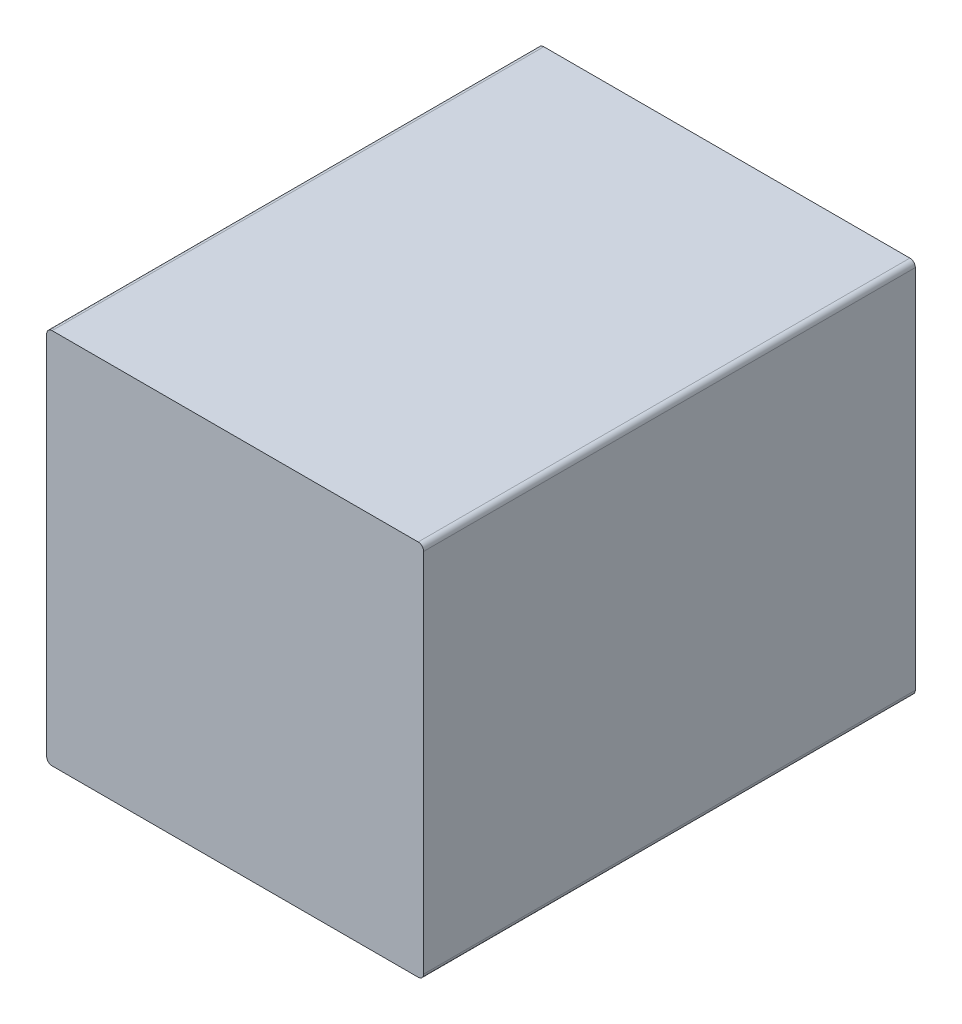
ISO-10303-21;
HEADER;
FILE_DESCRIPTION(('STEP AP214'),'2;1');
FILE_NAME('part.step','',(''),(''),'','','');
FILE_SCHEMA(('AUTOMOTIVE_DESIGN { 1 0 10303 214 1 1 1 1 }'));
ENDSEC;
DATA;
#1=APPLICATION_CONTEXT('core data for automotive mechanical design processes');
#2=APPLICATION_PROTOCOL_DEFINITION('international standard','automotive_design',2000,#1);
#3=PRODUCT_CONTEXT('',#1,'mechanical');
#4=PRODUCT('Part','Part','',(#3));
#5=PRODUCT_RELATED_PRODUCT_CATEGORY('part','',(#4));
#6=PRODUCT_DEFINITION_FORMATION('','',#4);
#7=PRODUCT_DEFINITION_CONTEXT('part definition',#1,'design');
#8=PRODUCT_DEFINITION('design','',#6,#7);
#9=PRODUCT_DEFINITION_SHAPE('','',#8);
#10=(LENGTH_UNIT() NAMED_UNIT(*) SI_UNIT(.MILLI.,.METRE.));
#11=(NAMED_UNIT(*) PLANE_ANGLE_UNIT() SI_UNIT($,.RADIAN.));
#12=(NAMED_UNIT(*) SI_UNIT($,.STERADIAN.) SOLID_ANGLE_UNIT());
#13=UNCERTAINTY_MEASURE_WITH_UNIT(LENGTH_MEASURE(1.E-05),#10,'distance_accuracy_value','');
#14=(GEOMETRIC_REPRESENTATION_CONTEXT(3) GLOBAL_UNCERTAINTY_ASSIGNED_CONTEXT((#13)) GLOBAL_UNIT_ASSIGNED_CONTEXT((#10,
#11,#12)) REPRESENTATION_CONTEXT('',''));
#15=CARTESIAN_POINT('',(0.,0.,0.));
#16=DIRECTION('',(0.,0.,1.));
#17=DIRECTION('',(1.,0.,0.));
#18=AXIS2_PLACEMENT_3D('',#15,#16,#17);
#19=CARTESIAN_POINT('',(-16.75,-16.75,56.8));
#20=DIRECTION('',(0.,0.,-1.));
#21=DIRECTION('',(-1.,0.,0.));
#22=AXIS2_PLACEMENT_3D('',#19,#20,#21);
#23=CYLINDRICAL_SURFACE('',#22,0.500000000000007);
#24=CARTESIAN_POINT('',(-16.75,-16.75,11.8));
#25=DIRECTION('',(0.,0.,1.));
#26=DIRECTION('',(1.,0.,0.));
#27=AXIS2_PLACEMENT_3D('',#24,#25,#26);
#28=CIRCLE('',#27,0.500000000000007);
#29=CARTESIAN_POINT('',(-17.25,-16.75,11.8));
#30=VERTEX_POINT('',#29);
#31=CARTESIAN_POINT('',(-16.75,-17.25,11.8));
#32=VERTEX_POINT('',#31);
#33=EDGE_CURVE('E131',#30,#32,#28,.T.);
#34=ORIENTED_EDGE('',*,*,#33,.T.);
#35=DIRECTION('',(0.,0.,-1.));
#36=VECTOR('',#35,1.);
#37=CARTESIAN_POINT('',(-16.75,-17.25,56.8));
#38=LINE('',#37,#36);
#39=CARTESIAN_POINT('',(-16.75,-17.25,56.8));
#40=VERTEX_POINT('',#39);
#41=EDGE_CURVE('E11',#40,#32,#38,.T.);
#42=ORIENTED_EDGE('',*,*,#41,.F.);
#43=CARTESIAN_POINT('',(-16.75,-16.75,56.8));
#44=DIRECTION('',(0.,0.,1.));
#45=DIRECTION('',(1.,0.,0.));
#46=AXIS2_PLACEMENT_3D('',#43,#44,#45);
#47=CIRCLE('',#46,0.500000000000007);
#48=CARTESIAN_POINT('',(-17.25,-16.75,56.8));
#49=VERTEX_POINT('',#48);
#50=EDGE_CURVE('E145',#49,#40,#47,.T.);
#51=ORIENTED_EDGE('',*,*,#50,.F.);
#52=DIRECTION('',(0.,0.,-1.));
#53=VECTOR('',#52,1.);
#54=CARTESIAN_POINT('',(-17.25,-16.75,56.8));
#55=LINE('',#54,#53);
#56=EDGE_CURVE('E127',#49,#30,#55,.T.);
#57=ORIENTED_EDGE('',*,*,#56,.T.);
#58=EDGE_LOOP('',(#34,#42,#51,#57));
#59=FACE_BOUND('',#58,.T.);
#60=ADVANCED_FACE('F35',(#59),#23,.T.);
#61=CARTESIAN_POINT('',(-16.75,-17.25,56.8));
#62=DIRECTION('',(0.,1.,0.));
#63=DIRECTION('',(0.,0.,1.));
#64=AXIS2_PLACEMENT_3D('',#61,#62,#63);
#65=PLANE('',#64);
#66=DIRECTION('',(1.,0.,0.));
#67=VECTOR('',#66,1.);
#68=CARTESIAN_POINT('',(-16.75,-17.25,11.8));
#69=LINE('',#68,#67);
#70=CARTESIAN_POINT('',(16.75,-17.25,11.8));
#71=VERTEX_POINT('',#70);
#72=EDGE_CURVE('E134',#32,#71,#69,.T.);
#73=ORIENTED_EDGE('',*,*,#72,.T.);
#74=DIRECTION('',(0.,0.,-1.));
#75=VECTOR('',#74,1.);
#76=CARTESIAN_POINT('',(16.75,-17.25,56.8));
#77=LINE('',#76,#75);
#78=CARTESIAN_POINT('',(16.75,-17.25,56.8));
#79=VERTEX_POINT('',#78);
#80=EDGE_CURVE('E43',#79,#71,#77,.T.);
#81=ORIENTED_EDGE('',*,*,#80,.F.);
#82=DIRECTION('',(1.,0.,0.));
#83=VECTOR('',#82,1.);
#84=CARTESIAN_POINT('',(-16.75,-17.25,56.8));
#85=LINE('',#84,#83);
#86=EDGE_CURVE('E94',#40,#79,#85,.T.);
#87=ORIENTED_EDGE('',*,*,#86,.F.);
#88=ORIENTED_EDGE('',*,*,#41,.T.);
#89=EDGE_LOOP('',(#73,#81,#87,#88));
#90=FACE_BOUND('',#89,.T.);
#91=ADVANCED_FACE('F180',(#90),#65,.F.);
#92=CARTESIAN_POINT('',(16.75,-16.75,56.8));
#93=DIRECTION('',(0.,0.,-1.));
#94=DIRECTION('',(-1.,0.,0.));
#95=AXIS2_PLACEMENT_3D('',#92,#93,#94);
#96=CYLINDRICAL_SURFACE('',#95,0.500000000000007);
#97=CARTESIAN_POINT('',(16.75,-16.75,11.8));
#98=DIRECTION('',(0.,0.,1.));
#99=DIRECTION('',(1.,0.,0.));
#100=AXIS2_PLACEMENT_3D('',#97,#98,#99);
#101=CIRCLE('',#100,0.500000000000007);
#102=CARTESIAN_POINT('',(17.25,-16.75,11.8));
#103=VERTEX_POINT('',#102);
#104=EDGE_CURVE('E136',#71,#103,#101,.T.);
#105=ORIENTED_EDGE('',*,*,#104,.T.);
#106=DIRECTION('',(0.,0.,-1.));
#107=VECTOR('',#106,1.);
#108=CARTESIAN_POINT('',(17.25,-16.75,56.8));
#109=LINE('',#108,#107);
#110=CARTESIAN_POINT('',(17.25,-16.75,56.8));
#111=VERTEX_POINT('',#110);
#112=EDGE_CURVE('E152',#111,#103,#109,.T.);
#113=ORIENTED_EDGE('',*,*,#112,.F.);
#114=CARTESIAN_POINT('',(16.75,-16.75,56.8));
#115=DIRECTION('',(0.,0.,1.));
#116=DIRECTION('',(1.,0.,0.));
#117=AXIS2_PLACEMENT_3D('',#114,#115,#116);
#118=CIRCLE('',#117,0.500000000000007);
#119=EDGE_CURVE('E160',#79,#111,#118,.T.);
#120=ORIENTED_EDGE('',*,*,#119,.F.);
#121=ORIENTED_EDGE('',*,*,#80,.T.);
#122=EDGE_LOOP('',(#105,#113,#120,#121));
#123=FACE_BOUND('',#122,.T.);
#124=ADVANCED_FACE('F158',(#123),#96,.T.);
#125=CARTESIAN_POINT('',(17.25,-16.75,56.8));
#126=DIRECTION('',(-1.,0.,0.));
#127=DIRECTION('',(0.,0.,1.));
#128=AXIS2_PLACEMENT_3D('',#125,#126,#127);
#129=PLANE('',#128);
#130=DIRECTION('',(0.,1.,0.));
#131=VECTOR('',#130,1.);
#132=CARTESIAN_POINT('',(17.25,-16.75,11.8));
#133=LINE('',#132,#131);
#134=CARTESIAN_POINT('',(17.25,16.75,11.8));
#135=VERTEX_POINT('',#134);
#136=EDGE_CURVE('E138',#103,#135,#133,.T.);
#137=ORIENTED_EDGE('',*,*,#136,.T.);
#138=DIRECTION('',(0.,0.,-1.));
#139=VECTOR('',#138,1.);
#140=CARTESIAN_POINT('',(17.25,16.75,56.8));
#141=LINE('',#140,#139);
#142=CARTESIAN_POINT('',(17.25,16.75,56.8));
#143=VERTEX_POINT('',#142);
#144=EDGE_CURVE('E149',#143,#135,#141,.T.);
#145=ORIENTED_EDGE('',*,*,#144,.F.);
#146=DIRECTION('',(0.,1.,0.));
#147=VECTOR('',#146,1.);
#148=CARTESIAN_POINT('',(17.25,-16.75,56.8));
#149=LINE('',#148,#147);
#150=EDGE_CURVE('E172',#111,#143,#149,.T.);
#151=ORIENTED_EDGE('',*,*,#150,.F.);
#152=ORIENTED_EDGE('',*,*,#112,.T.);
#153=EDGE_LOOP('',(#137,#145,#151,#152));
#154=FACE_BOUND('',#153,.T.);
#155=ADVANCED_FACE('F168',(#154),#129,.F.);
#156=CARTESIAN_POINT('',(16.75,16.75,56.8));
#157=DIRECTION('',(0.,0.,-1.));
#158=DIRECTION('',(-1.,0.,0.));
#159=AXIS2_PLACEMENT_3D('',#156,#157,#158);
#160=CYLINDRICAL_SURFACE('',#159,0.500000000000007);
#161=CARTESIAN_POINT('',(16.75,16.75,11.8));
#162=DIRECTION('',(0.,0.,1.));
#163=DIRECTION('',(1.,0.,0.));
#164=AXIS2_PLACEMENT_3D('',#161,#162,#163);
#165=CIRCLE('',#164,0.500000000000007);
#166=CARTESIAN_POINT('',(16.75,17.25,11.8));
#167=VERTEX_POINT('',#166);
#168=EDGE_CURVE('E140',#135,#167,#165,.T.);
#169=ORIENTED_EDGE('',*,*,#168,.T.);
#170=DIRECTION('',(0.,0.,-1.));
#171=VECTOR('',#170,1.);
#172=CARTESIAN_POINT('',(16.75,17.25,56.8));
#173=LINE('',#172,#171);
#174=CARTESIAN_POINT('',(16.75,17.25,56.8));
#175=VERTEX_POINT('',#174);
#176=EDGE_CURVE('E122',#175,#167,#173,.T.);
#177=ORIENTED_EDGE('',*,*,#176,.F.);
#178=CARTESIAN_POINT('',(16.75,16.75,56.8));
#179=DIRECTION('',(0.,0.,1.));
#180=DIRECTION('',(1.,0.,0.));
#181=AXIS2_PLACEMENT_3D('',#178,#179,#180);
#182=CIRCLE('',#181,0.500000000000007);
#183=EDGE_CURVE('E113',#143,#175,#182,.T.);
#184=ORIENTED_EDGE('',*,*,#183,.F.);
#185=ORIENTED_EDGE('',*,*,#144,.T.);
#186=EDGE_LOOP('',(#169,#177,#184,#185));
#187=FACE_BOUND('',#186,.T.);
#188=ADVANCED_FACE('F171',(#187),#160,.T.);
#189=CARTESIAN_POINT('',(16.75,17.25,56.8));
#190=DIRECTION('',(0.,-1.,0.));
#191=DIRECTION('',(0.,0.,-1.));
#192=AXIS2_PLACEMENT_3D('',#189,#190,#191);
#193=PLANE('',#192);
#194=DIRECTION('',(-1.,0.,0.));
#195=VECTOR('',#194,1.);
#196=CARTESIAN_POINT('',(16.75,17.25,11.8));
#197=LINE('',#196,#195);
#198=CARTESIAN_POINT('',(-16.75,17.25,11.8));
#199=VERTEX_POINT('',#198);
#200=EDGE_CURVE('E121',#167,#199,#197,.T.);
#201=ORIENTED_EDGE('',*,*,#200,.T.);
#202=DIRECTION('',(0.,0.,-1.));
#203=VECTOR('',#202,1.);
#204=CARTESIAN_POINT('',(-16.75,17.25,56.8));
#205=LINE('',#204,#203);
#206=CARTESIAN_POINT('',(-16.75,17.25,56.8));
#207=VERTEX_POINT('',#206);
#208=EDGE_CURVE('E118',#207,#199,#205,.T.);
#209=ORIENTED_EDGE('',*,*,#208,.F.);
#210=DIRECTION('',(-1.,0.,0.));
#211=VECTOR('',#210,1.);
#212=CARTESIAN_POINT('',(16.75,17.25,56.8));
#213=LINE('',#212,#211);
#214=EDGE_CURVE('E107',#175,#207,#213,.T.);
#215=ORIENTED_EDGE('',*,*,#214,.F.);
#216=ORIENTED_EDGE('',*,*,#176,.T.);
#217=EDGE_LOOP('',(#201,#209,#215,#216));
#218=FACE_BOUND('',#217,.T.);
#219=ADVANCED_FACE('F119',(#218),#193,.F.);
#220=CARTESIAN_POINT('',(-16.75,16.75,56.8));
#221=DIRECTION('',(0.,0.,-1.));
#222=DIRECTION('',(-1.,0.,0.));
#223=AXIS2_PLACEMENT_3D('',#220,#221,#222);
#224=CYLINDRICAL_SURFACE('',#223,0.500000000000007);
#225=CARTESIAN_POINT('',(-16.75,16.75,11.8));
#226=DIRECTION('',(0.,0.,1.));
#227=DIRECTION('',(1.,0.,0.));
#228=AXIS2_PLACEMENT_3D('',#225,#226,#227);
#229=CIRCLE('',#228,0.500000000000007);
#230=CARTESIAN_POINT('',(-17.25,16.75,11.8));
#231=VERTEX_POINT('',#230);
#232=EDGE_CURVE('E80',#199,#231,#229,.T.);
#233=ORIENTED_EDGE('',*,*,#232,.T.);
#234=DIRECTION('',(0.,0.,-1.));
#235=VECTOR('',#234,1.);
#236=CARTESIAN_POINT('',(-17.25,16.75,56.8));
#237=LINE('',#236,#235);
#238=CARTESIAN_POINT('',(-17.25,16.75,56.8));
#239=VERTEX_POINT('',#238);
#240=EDGE_CURVE('E123',#239,#231,#237,.T.);
#241=ORIENTED_EDGE('',*,*,#240,.F.);
#242=CARTESIAN_POINT('',(-16.75,16.75,56.8));
#243=DIRECTION('',(0.,0.,1.));
#244=DIRECTION('',(1.,0.,0.));
#245=AXIS2_PLACEMENT_3D('',#242,#243,#244);
#246=CIRCLE('',#245,0.500000000000007);
#247=EDGE_CURVE('E111',#207,#239,#246,.T.);
#248=ORIENTED_EDGE('',*,*,#247,.F.);
#249=ORIENTED_EDGE('',*,*,#208,.T.);
#250=EDGE_LOOP('',(#233,#241,#248,#249));
#251=FACE_BOUND('',#250,.T.);
#252=ADVANCED_FACE('F125',(#251),#224,.T.);
#253=CARTESIAN_POINT('',(-17.25,16.75,56.8));
#254=DIRECTION('',(1.,0.,0.));
#255=DIRECTION('',(0.,0.,-1.));
#256=AXIS2_PLACEMENT_3D('',#253,#254,#255);
#257=PLANE('',#256);
#258=DIRECTION('',(0.,-1.,0.));
#259=VECTOR('',#258,1.);
#260=CARTESIAN_POINT('',(-17.25,16.75,11.8));
#261=LINE('',#260,#259);
#262=EDGE_CURVE('E86',#231,#30,#261,.T.);
#263=ORIENTED_EDGE('',*,*,#262,.T.);
#264=ORIENTED_EDGE('',*,*,#56,.F.);
#265=DIRECTION('',(0.,-1.,0.));
#266=VECTOR('',#265,1.);
#267=CARTESIAN_POINT('',(-17.25,16.75,56.8));
#268=LINE('',#267,#266);
#269=EDGE_CURVE('E51',#239,#49,#268,.T.);
#270=ORIENTED_EDGE('',*,*,#269,.F.);
#271=ORIENTED_EDGE('',*,*,#240,.T.);
#272=EDGE_LOOP('',(#263,#264,#270,#271));
#273=FACE_BOUND('',#272,.T.);
#274=ADVANCED_FACE('F196',(#273),#257,.F.);
#275=CARTESIAN_POINT('',(-16.75,-16.75,56.8));
#276=DIRECTION('',(0.,0.,1.));
#277=DIRECTION('',(1.,0.,0.));
#278=AXIS2_PLACEMENT_3D('',#275,#276,#277);
#279=PLANE('',#278);
#280=ORIENTED_EDGE('',*,*,#50,.T.);
#281=ORIENTED_EDGE('',*,*,#86,.T.);
#282=ORIENTED_EDGE('',*,*,#119,.T.);
#283=ORIENTED_EDGE('',*,*,#150,.T.);
#284=ORIENTED_EDGE('',*,*,#183,.T.);
#285=ORIENTED_EDGE('',*,*,#214,.T.);
#286=ORIENTED_EDGE('',*,*,#247,.T.);
#287=ORIENTED_EDGE('',*,*,#269,.T.);
#288=EDGE_LOOP('',(#280,#281,#282,#283,#284,#285,#286,#287));
#289=FACE_BOUND('',#288,.T.);
#290=ADVANCED_FACE('F109',(#289),#279,.T.);
#291=CARTESIAN_POINT('',(-16.75,-16.75,11.8));
#292=DIRECTION('',(0.,0.,1.));
#293=DIRECTION('',(1.,0.,0.));
#294=AXIS2_PLACEMENT_3D('',#291,#292,#293);
#295=PLANE('',#294);
#296=ORIENTED_EDGE('',*,*,#33,.F.);
#297=ORIENTED_EDGE('',*,*,#262,.F.);
#298=ORIENTED_EDGE('',*,*,#232,.F.);
#299=ORIENTED_EDGE('',*,*,#200,.F.);
#300=ORIENTED_EDGE('',*,*,#168,.F.);
#301=ORIENTED_EDGE('',*,*,#136,.F.);
#302=ORIENTED_EDGE('',*,*,#104,.F.);
#303=ORIENTED_EDGE('',*,*,#72,.F.);
#304=EDGE_LOOP('',(#296,#297,#298,#299,#300,#301,#302,#303));
#305=FACE_BOUND('',#304,.T.);
#306=ADVANCED_FACE('F164',(#305),#295,.F.);
#307=CLOSED_SHELL('',(#60,#91,#124,#155,#188,#219,#252,#274,#290,#306));
#308=MANIFOLD_SOLID_BREP('B2',#307);
#309=ADVANCED_BREP_SHAPE_REPRESENTATION('',(#18,#308),#14);
#310=SHAPE_DEFINITION_REPRESENTATION(#9,#309);
ENDSEC;
END-ISO-10303-21;
